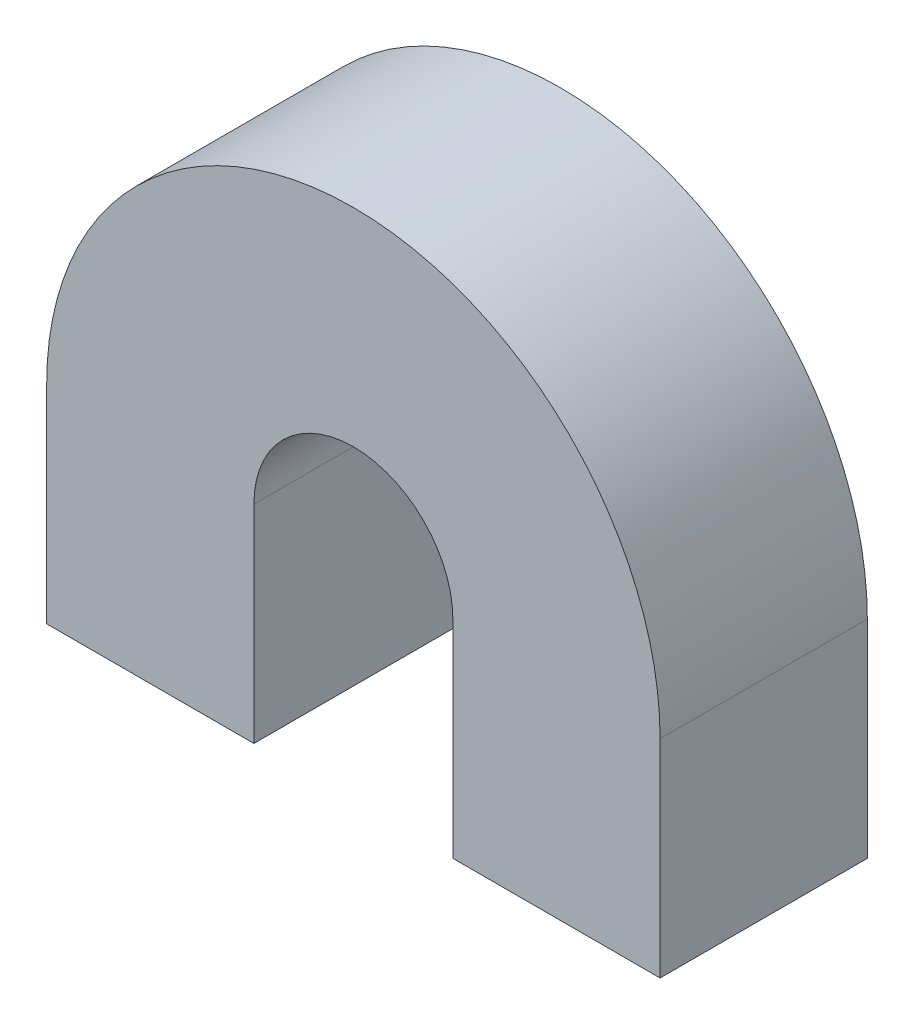
ISO-10303-21;
HEADER;
FILE_DESCRIPTION(('STEP AP214'),'2;1');
FILE_NAME('part.step','',(''),(''),'','','');
FILE_SCHEMA(('AUTOMOTIVE_DESIGN { 1 0 10303 214 1 1 1 1 }'));
ENDSEC;
DATA;
#1=APPLICATION_CONTEXT('core data for automotive mechanical design processes');
#2=APPLICATION_PROTOCOL_DEFINITION('international standard','automotive_design',2000,#1);
#3=PRODUCT_CONTEXT('',#1,'mechanical');
#4=PRODUCT('Part','Part','',(#3));
#5=PRODUCT_RELATED_PRODUCT_CATEGORY('part','',(#4));
#6=PRODUCT_DEFINITION_FORMATION('','',#4);
#7=PRODUCT_DEFINITION_CONTEXT('part definition',#1,'design');
#8=PRODUCT_DEFINITION('design','',#6,#7);
#9=PRODUCT_DEFINITION_SHAPE('','',#8);
#10=(LENGTH_UNIT() NAMED_UNIT(*) SI_UNIT(.MILLI.,.METRE.));
#11=(NAMED_UNIT(*) PLANE_ANGLE_UNIT() SI_UNIT($,.RADIAN.));
#12=(NAMED_UNIT(*) SI_UNIT($,.STERADIAN.) SOLID_ANGLE_UNIT());
#13=UNCERTAINTY_MEASURE_WITH_UNIT(LENGTH_MEASURE(1.E-05),#10,'distance_accuracy_value','');
#14=(GEOMETRIC_REPRESENTATION_CONTEXT(3) GLOBAL_UNCERTAINTY_ASSIGNED_CONTEXT((#13)) GLOBAL_UNIT_ASSIGNED_CONTEXT((#10,
#11,#12)) REPRESENTATION_CONTEXT('',''));
#15=CARTESIAN_POINT('',(0.,0.,0.));
#16=DIRECTION('',(0.,0.,1.));
#17=DIRECTION('',(1.,0.,0.));
#18=AXIS2_PLACEMENT_3D('',#15,#16,#17);
#19=CARTESIAN_POINT('',(-4.8,8.18666666666666,10.));
#20=DIRECTION('',(0.,1.,0.));
#21=DIRECTION('',(0.,0.,1.));
#22=AXIS2_PLACEMENT_3D('',#19,#20,#21);
#23=PLANE('',#22);
#24=DIRECTION('',(1.,0.,0.));
#25=VECTOR('',#24,1.);
#26=CARTESIAN_POINT('',(-4.8,8.18666666666666,0.));
#27=LINE('',#26,#25);
#28=CARTESIAN_POINT('',(-14.8,8.18666666666666,0.));
#29=VERTEX_POINT('',#28);
#30=CARTESIAN_POINT('',(-4.8,8.18666666666666,0.));
#31=VERTEX_POINT('',#30);
#32=EDGE_CURVE('E129',#29,#31,#27,.T.);
#33=ORIENTED_EDGE('',*,*,#32,.T.);
#34=DIRECTION('',(0.,0.,-1.));
#35=VECTOR('',#34,1.);
#36=CARTESIAN_POINT('',(-4.8,8.18666666666666,10.));
#37=LINE('',#36,#35);
#38=CARTESIAN_POINT('',(-4.8,8.18666666666666,10.));
#39=VERTEX_POINT('',#38);
#40=EDGE_CURVE('E11',#39,#31,#37,.T.);
#41=ORIENTED_EDGE('',*,*,#40,.F.);
#42=DIRECTION('',(1.,0.,0.));
#43=VECTOR('',#42,1.);
#44=CARTESIAN_POINT('',(-4.8,8.18666666666666,10.));
#45=LINE('',#44,#43);
#46=CARTESIAN_POINT('',(-14.8,8.18666666666666,10.));
#47=VERTEX_POINT('',#46);
#48=EDGE_CURVE('E143',#47,#39,#45,.T.);
#49=ORIENTED_EDGE('',*,*,#48,.F.);
#50=DIRECTION('',(0.,0.,-1.));
#51=VECTOR('',#50,1.);
#52=CARTESIAN_POINT('',(-14.8,8.18666666666666,10.));
#53=LINE('',#52,#51);
#54=EDGE_CURVE('E125',#47,#29,#53,.T.);
#55=ORIENTED_EDGE('',*,*,#54,.T.);
#56=EDGE_LOOP('',(#33,#41,#49,#55));
#57=FACE_BOUND('',#56,.T.);
#58=ADVANCED_FACE('F33',(#57),#23,.F.);
#59=CARTESIAN_POINT('',(-4.8,8.18666666666666,10.));
#60=DIRECTION('',(-1.,0.,0.));
#61=DIRECTION('',(0.,-1.,0.));
#62=AXIS2_PLACEMENT_3D('',#59,#60,#61);
#63=PLANE('',#62);
#64=DIRECTION('',(0.,1.,0.));
#65=VECTOR('',#64,1.);
#66=CARTESIAN_POINT('',(-4.8,8.18666666666666,0.));
#67=LINE('',#66,#65);
#68=CARTESIAN_POINT('',(-4.8,18.1866666666667,0.));
#69=VERTEX_POINT('',#68);
#70=EDGE_CURVE('E132',#31,#69,#67,.T.);
#71=ORIENTED_EDGE('',*,*,#70,.T.);
#72=DIRECTION('',(0.,0.,-1.));
#73=VECTOR('',#72,1.);
#74=CARTESIAN_POINT('',(-4.8,18.1866666666667,10.));
#75=LINE('',#74,#73);
#76=CARTESIAN_POINT('',(-4.8,18.1866666666667,10.));
#77=VERTEX_POINT('',#76);
#78=EDGE_CURVE('E41',#77,#69,#75,.T.);
#79=ORIENTED_EDGE('',*,*,#78,.F.);
#80=DIRECTION('',(0.,1.,0.));
#81=VECTOR('',#80,1.);
#82=CARTESIAN_POINT('',(-4.8,8.18666666666666,10.));
#83=LINE('',#82,#81);
#84=EDGE_CURVE('E92',#39,#77,#83,.T.);
#85=ORIENTED_EDGE('',*,*,#84,.F.);
#86=ORIENTED_EDGE('',*,*,#40,.T.);
#87=EDGE_LOOP('',(#71,#79,#85,#86));
#88=FACE_BOUND('',#87,.T.);
#89=ADVANCED_FACE('F178',(#88),#63,.F.);
#90=CARTESIAN_POINT('',(0.,18.1866666666667,10.));
#91=DIRECTION('',(0.,0.,-1.));
#92=DIRECTION('',(-1.,0.,0.));
#93=AXIS2_PLACEMENT_3D('',#90,#91,#92);
#94=CYLINDRICAL_SURFACE('',#93,4.8);
#95=CARTESIAN_POINT('',(0.,18.1866666666667,0.));
#96=DIRECTION('',(0.,0.,-1.));
#97=DIRECTION('',(-1.,0.,0.));
#98=AXIS2_PLACEMENT_3D('',#95,#96,#97);
#99=CIRCLE('',#98,4.8);
#100=CARTESIAN_POINT('',(4.8,18.1866666666667,0.));
#101=VERTEX_POINT('',#100);
#102=EDGE_CURVE('E134',#69,#101,#99,.T.);
#103=ORIENTED_EDGE('',*,*,#102,.T.);
#104=DIRECTION('',(0.,0.,-1.));
#105=VECTOR('',#104,1.);
#106=CARTESIAN_POINT('',(4.8,18.1866666666667,10.));
#107=LINE('',#106,#105);
#108=CARTESIAN_POINT('',(4.8,18.1866666666667,10.));
#109=VERTEX_POINT('',#108);
#110=EDGE_CURVE('E150',#109,#101,#107,.T.);
#111=ORIENTED_EDGE('',*,*,#110,.F.);
#112=CARTESIAN_POINT('',(0.,18.1866666666667,10.));
#113=DIRECTION('',(0.,0.,-1.));
#114=DIRECTION('',(-1.,0.,0.));
#115=AXIS2_PLACEMENT_3D('',#112,#113,#114);
#116=CIRCLE('',#115,4.8);
#117=EDGE_CURVE('E158',#77,#109,#116,.T.);
#118=ORIENTED_EDGE('',*,*,#117,.F.);
#119=ORIENTED_EDGE('',*,*,#78,.T.);
#120=EDGE_LOOP('',(#103,#111,#118,#119));
#121=FACE_BOUND('',#120,.T.);
#122=ADVANCED_FACE('F156',(#121),#94,.F.);
#123=CARTESIAN_POINT('',(4.8,18.1866666666667,10.));
#124=DIRECTION('',(1.,0.,0.));
#125=DIRECTION('',(0.,1.,0.));
#126=AXIS2_PLACEMENT_3D('',#123,#124,#125);
#127=PLANE('',#126);
#128=DIRECTION('',(0.,-1.,0.));
#129=VECTOR('',#128,1.);
#130=CARTESIAN_POINT('',(4.8,18.1866666666667,0.));
#131=LINE('',#130,#129);
#132=CARTESIAN_POINT('',(4.8,8.18666666666666,0.));
#133=VERTEX_POINT('',#132);
#134=EDGE_CURVE('E136',#101,#133,#131,.T.);
#135=ORIENTED_EDGE('',*,*,#134,.T.);
#136=DIRECTION('',(0.,0.,-1.));
#137=VECTOR('',#136,1.);
#138=CARTESIAN_POINT('',(4.8,8.18666666666666,10.));
#139=LINE('',#138,#137);
#140=CARTESIAN_POINT('',(4.8,8.18666666666666,10.));
#141=VERTEX_POINT('',#140);
#142=EDGE_CURVE('E147',#141,#133,#139,.T.);
#143=ORIENTED_EDGE('',*,*,#142,.F.);
#144=DIRECTION('',(0.,-1.,0.));
#145=VECTOR('',#144,1.);
#146=CARTESIAN_POINT('',(4.8,18.1866666666667,10.));
#147=LINE('',#146,#145);
#148=EDGE_CURVE('E170',#109,#141,#147,.T.);
#149=ORIENTED_EDGE('',*,*,#148,.F.);
#150=ORIENTED_EDGE('',*,*,#110,.T.);
#151=EDGE_LOOP('',(#135,#143,#149,#150));
#152=FACE_BOUND('',#151,.T.);
#153=ADVANCED_FACE('F166',(#152),#127,.F.);
#154=CARTESIAN_POINT('',(14.8,8.18666666666666,10.));
#155=DIRECTION('',(0.,1.,0.));
#156=DIRECTION('',(0.,0.,1.));
#157=AXIS2_PLACEMENT_3D('',#154,#155,#156);
#158=PLANE('',#157);
#159=DIRECTION('',(1.,0.,0.));
#160=VECTOR('',#159,1.);
#161=CARTESIAN_POINT('',(14.8,8.18666666666666,0.));
#162=LINE('',#161,#160);
#163=CARTESIAN_POINT('',(14.8,8.18666666666666,0.));
#164=VERTEX_POINT('',#163);
#165=EDGE_CURVE('E138',#133,#164,#162,.T.);
#166=ORIENTED_EDGE('',*,*,#165,.T.);
#167=DIRECTION('',(0.,0.,-1.));
#168=VECTOR('',#167,1.);
#169=CARTESIAN_POINT('',(14.8,8.18666666666666,10.));
#170=LINE('',#169,#168);
#171=CARTESIAN_POINT('',(14.8,8.18666666666666,10.));
#172=VERTEX_POINT('',#171);
#173=EDGE_CURVE('E120',#172,#164,#170,.T.);
#174=ORIENTED_EDGE('',*,*,#173,.F.);
#175=DIRECTION('',(1.,0.,0.));
#176=VECTOR('',#175,1.);
#177=CARTESIAN_POINT('',(14.8,8.18666666666666,10.));
#178=LINE('',#177,#176);
#179=EDGE_CURVE('E111',#141,#172,#178,.T.);
#180=ORIENTED_EDGE('',*,*,#179,.F.);
#181=ORIENTED_EDGE('',*,*,#142,.T.);
#182=EDGE_LOOP('',(#166,#174,#180,#181));
#183=FACE_BOUND('',#182,.T.);
#184=ADVANCED_FACE('F169',(#183),#158,.F.);
#185=CARTESIAN_POINT('',(14.8,8.18666666666666,10.));
#186=DIRECTION('',(-1.,0.,0.));
#187=DIRECTION('',(0.,-1.,0.));
#188=AXIS2_PLACEMENT_3D('',#185,#186,#187);
#189=PLANE('',#188);
#190=DIRECTION('',(0.,1.,0.));
#191=VECTOR('',#190,1.);
#192=CARTESIAN_POINT('',(14.8,8.18666666666666,0.));
#193=LINE('',#192,#191);
#194=CARTESIAN_POINT('',(14.8,18.1866666666667,0.));
#195=VERTEX_POINT('',#194);
#196=EDGE_CURVE('E119',#164,#195,#193,.T.);
#197=ORIENTED_EDGE('',*,*,#196,.T.);
#198=DIRECTION('',(0.,0.,-1.));
#199=VECTOR('',#198,1.);
#200=CARTESIAN_POINT('',(14.8,18.1866666666667,10.));
#201=LINE('',#200,#199);
#202=CARTESIAN_POINT('',(14.8,18.1866666666667,10.));
#203=VERTEX_POINT('',#202);
#204=EDGE_CURVE('E116',#203,#195,#201,.T.);
#205=ORIENTED_EDGE('',*,*,#204,.F.);
#206=DIRECTION('',(0.,1.,0.));
#207=VECTOR('',#206,1.);
#208=CARTESIAN_POINT('',(14.8,8.18666666666666,10.));
#209=LINE('',#208,#207);
#210=EDGE_CURVE('E105',#172,#203,#209,.T.);
#211=ORIENTED_EDGE('',*,*,#210,.F.);
#212=ORIENTED_EDGE('',*,*,#173,.T.);
#213=EDGE_LOOP('',(#197,#205,#211,#212));
#214=FACE_BOUND('',#213,.T.);
#215=ADVANCED_FACE('F117',(#214),#189,.F.);
#216=CARTESIAN_POINT('',(0.,18.1866666666667,10.));
#217=DIRECTION('',(0.,0.,-1.));
#218=DIRECTION('',(-1.,0.,0.));
#219=AXIS2_PLACEMENT_3D('',#216,#217,#218);
#220=CYLINDRICAL_SURFACE('',#219,14.8);
#221=CARTESIAN_POINT('',(0.,18.1866666666667,0.));
#222=DIRECTION('',(0.,0.,1.));
#223=DIRECTION('',(-1.,0.,0.));
#224=AXIS2_PLACEMENT_3D('',#221,#222,#223);
#225=CIRCLE('',#224,14.8);
#226=CARTESIAN_POINT('',(-14.8,18.1866666666667,0.));
#227=VERTEX_POINT('',#226);
#228=EDGE_CURVE('E78',#195,#227,#225,.T.);
#229=ORIENTED_EDGE('',*,*,#228,.T.);
#230=DIRECTION('',(0.,0.,-1.));
#231=VECTOR('',#230,1.);
#232=CARTESIAN_POINT('',(-14.8,18.1866666666667,10.));
#233=LINE('',#232,#231);
#234=CARTESIAN_POINT('',(-14.8,18.1866666666667,10.));
#235=VERTEX_POINT('',#234);
#236=EDGE_CURVE('E121',#235,#227,#233,.T.);
#237=ORIENTED_EDGE('',*,*,#236,.F.);
#238=CARTESIAN_POINT('',(0.,18.1866666666667,10.));
#239=DIRECTION('',(0.,0.,1.));
#240=DIRECTION('',(-1.,0.,0.));
#241=AXIS2_PLACEMENT_3D('',#238,#239,#240);
#242=CIRCLE('',#241,14.8);
#243=EDGE_CURVE('E109',#203,#235,#242,.T.);
#244=ORIENTED_EDGE('',*,*,#243,.F.);
#245=ORIENTED_EDGE('',*,*,#204,.T.);
#246=EDGE_LOOP('',(#229,#237,#244,#245));
#247=FACE_BOUND('',#246,.T.);
#248=ADVANCED_FACE('F123',(#247),#220,.T.);
#249=CARTESIAN_POINT('',(-14.8,8.18666666666666,10.));
#250=DIRECTION('',(1.,0.,0.));
#251=DIRECTION('',(0.,1.,0.));
#252=AXIS2_PLACEMENT_3D('',#249,#250,#251);
#253=PLANE('',#252);
#254=DIRECTION('',(0.,-1.,0.));
#255=VECTOR('',#254,1.);
#256=CARTESIAN_POINT('',(-14.8,8.18666666666666,0.));
#257=LINE('',#256,#255);
#258=EDGE_CURVE('E84',#227,#29,#257,.T.);
#259=ORIENTED_EDGE('',*,*,#258,.T.);
#260=ORIENTED_EDGE('',*,*,#54,.F.);
#261=DIRECTION('',(0.,-1.,0.));
#262=VECTOR('',#261,1.);
#263=CARTESIAN_POINT('',(-14.8,8.18666666666666,10.));
#264=LINE('',#263,#262);
#265=EDGE_CURVE('E49',#235,#47,#264,.T.);
#266=ORIENTED_EDGE('',*,*,#265,.F.);
#267=ORIENTED_EDGE('',*,*,#236,.T.);
#268=EDGE_LOOP('',(#259,#260,#266,#267));
#269=FACE_BOUND('',#268,.T.);
#270=ADVANCED_FACE('F194',(#269),#253,.F.);
#271=CARTESIAN_POINT('',(0.,18.1866666666667,10.));
#272=DIRECTION('',(0.,0.,-1.));
#273=DIRECTION('',(-1.,0.,0.));
#274=AXIS2_PLACEMENT_3D('',#271,#272,#273);
#275=PLANE('',#274);
#276=ORIENTED_EDGE('',*,*,#48,.T.);
#277=ORIENTED_EDGE('',*,*,#84,.T.);
#278=ORIENTED_EDGE('',*,*,#117,.T.);
#279=ORIENTED_EDGE('',*,*,#148,.T.);
#280=ORIENTED_EDGE('',*,*,#179,.T.);
#281=ORIENTED_EDGE('',*,*,#210,.T.);
#282=ORIENTED_EDGE('',*,*,#243,.T.);
#283=ORIENTED_EDGE('',*,*,#265,.T.);
#284=EDGE_LOOP('',(#276,#277,#278,#279,#280,#281,#282,#283));
#285=FACE_BOUND('',#284,.T.);
#286=ADVANCED_FACE('F107',(#285),#275,.F.);
#287=CARTESIAN_POINT('',(0.,18.1866666666667,0.));
#288=DIRECTION('',(0.,0.,-1.));
#289=DIRECTION('',(-1.,0.,0.));
#290=AXIS2_PLACEMENT_3D('',#287,#288,#289);
#291=PLANE('',#290);
#292=ORIENTED_EDGE('',*,*,#32,.F.);
#293=ORIENTED_EDGE('',*,*,#258,.F.);
#294=ORIENTED_EDGE('',*,*,#228,.F.);
#295=ORIENTED_EDGE('',*,*,#196,.F.);
#296=ORIENTED_EDGE('',*,*,#165,.F.);
#297=ORIENTED_EDGE('',*,*,#134,.F.);
#298=ORIENTED_EDGE('',*,*,#102,.F.);
#299=ORIENTED_EDGE('',*,*,#70,.F.);
#300=EDGE_LOOP('',(#292,#293,#294,#295,#296,#297,#298,#299));
#301=FACE_BOUND('',#300,.T.);
#302=ADVANCED_FACE('F162',(#301),#291,.T.);
#303=CLOSED_SHELL('',(#58,#89,#122,#153,#184,#215,#248,#270,#286,#302));
#304=MANIFOLD_SOLID_BREP('B2',#303);
#305=ADVANCED_BREP_SHAPE_REPRESENTATION('',(#18,#304),#14);
#306=SHAPE_DEFINITION_REPRESENTATION(#9,#305);
ENDSEC;
END-ISO-10303-21;
